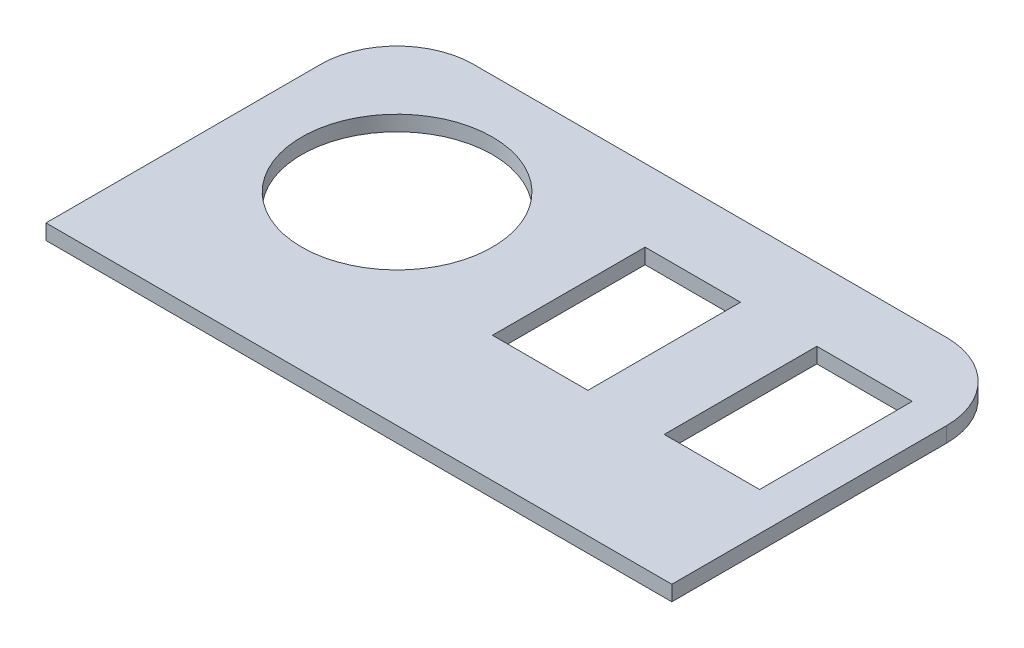
ISO-10303-21;
HEADER;
FILE_DESCRIPTION(('STEP AP214'),'2;1');
FILE_NAME('part.step','',(''),(''),'','','');
FILE_SCHEMA(('AUTOMOTIVE_DESIGN { 1 0 10303 214 1 1 1 1 }'));
ENDSEC;
DATA;
#1=APPLICATION_CONTEXT('core data for automotive mechanical design processes');
#2=APPLICATION_PROTOCOL_DEFINITION('international standard','automotive_design',2000,#1);
#3=PRODUCT_CONTEXT('',#1,'mechanical');
#4=PRODUCT('Part','Part','',(#3));
#5=PRODUCT_RELATED_PRODUCT_CATEGORY('part','',(#4));
#6=PRODUCT_DEFINITION_FORMATION('','',#4);
#7=PRODUCT_DEFINITION_CONTEXT('part definition',#1,'design');
#8=PRODUCT_DEFINITION('design','',#6,#7);
#9=PRODUCT_DEFINITION_SHAPE('','',#8);
#10=(LENGTH_UNIT() NAMED_UNIT(*) SI_UNIT(.MILLI.,.METRE.));
#11=(NAMED_UNIT(*) PLANE_ANGLE_UNIT() SI_UNIT($,.RADIAN.));
#12=(NAMED_UNIT(*) SI_UNIT($,.STERADIAN.) SOLID_ANGLE_UNIT());
#13=UNCERTAINTY_MEASURE_WITH_UNIT(LENGTH_MEASURE(1.E-05),#10,'distance_accuracy_value','');
#14=(GEOMETRIC_REPRESENTATION_CONTEXT(3) GLOBAL_UNCERTAINTY_ASSIGNED_CONTEXT((#13)) GLOBAL_UNIT_ASSIGNED_CONTEXT((#10,
#11,#12)) REPRESENTATION_CONTEXT('',''));
#15=CARTESIAN_POINT('',(0.,0.,0.));
#16=DIRECTION('',(0.,0.,1.));
#17=DIRECTION('',(1.,0.,0.));
#18=AXIS2_PLACEMENT_3D('',#15,#16,#17);
#19=CARTESIAN_POINT('',(0.,2.,0.));
#20=DIRECTION('',(0.,1.,0.));
#21=DIRECTION('',(0.,0.,1.));
#22=AXIS2_PLACEMENT_3D('',#19,#20,#21);
#23=PLANE('',#22);
#24=DIRECTION('',(-1.,0.,0.));
#25=VECTOR('',#24,1.);
#26=CARTESIAN_POINT('',(1.,2.,-13.5));
#27=LINE('',#26,#25);
#28=CARTESIAN_POINT('',(13.5,2.,-13.5));
#29=VERTEX_POINT('',#28);
#30=CARTESIAN_POINT('',(1.,2.,-13.5));
#31=VERTEX_POINT('',#30);
#32=EDGE_CURVE('E183',#29,#31,#27,.T.);
#33=ORIENTED_EDGE('',*,*,#32,.F.);
#34=DIRECTION('',(0.,0.,-1.));
#35=VECTOR('',#34,1.);
#36=CARTESIAN_POINT('',(13.5,2.,6.5));
#37=LINE('',#36,#35);
#38=CARTESIAN_POINT('',(13.5,2.,6.5));
#39=VERTEX_POINT('',#38);
#40=EDGE_CURVE('E181',#39,#29,#37,.T.);
#41=ORIENTED_EDGE('',*,*,#40,.F.);
#42=DIRECTION('',(1.,0.,0.));
#43=VECTOR('',#42,1.);
#44=CARTESIAN_POINT('',(1.,2.,6.5));
#45=LINE('',#44,#43);
#46=CARTESIAN_POINT('',(1.,2.,6.5));
#47=VERTEX_POINT('',#46);
#48=EDGE_CURVE('E189',#47,#39,#45,.T.);
#49=ORIENTED_EDGE('',*,*,#48,.F.);
#50=DIRECTION('',(0.,0.,1.));
#51=VECTOR('',#50,1.);
#52=CARTESIAN_POINT('',(1.,2.,6.5));
#53=LINE('',#52,#51);
#54=EDGE_CURVE('E186',#31,#47,#53,.T.);
#55=ORIENTED_EDGE('',*,*,#54,.F.);
#56=EDGE_LOOP('',(#33,#41,#49,#55));
#57=FACE_BOUND('',#56,.T.);
#58=DIRECTION('',(0.,0.,-1.));
#59=VECTOR('',#58,1.);
#60=CARTESIAN_POINT('',(41.,2.,-23.));
#61=LINE('',#60,#59);
#62=CARTESIAN_POINT('',(41.,2.,23.));
#63=VERTEX_POINT('',#62);
#64=CARTESIAN_POINT('',(41.,2.,-13.));
#65=VERTEX_POINT('',#64);
#66=EDGE_CURVE('E218',#63,#65,#61,.T.);
#67=ORIENTED_EDGE('',*,*,#66,.T.);
#68=CARTESIAN_POINT('',(31.,2.,-13.));
#69=DIRECTION('',(0.,1.,0.));
#70=DIRECTION('',(0.,0.,1.));
#71=AXIS2_PLACEMENT_3D('',#68,#69,#70);
#72=CIRCLE('',#71,10.);
#73=CARTESIAN_POINT('',(31.,2.,-23.));
#74=VERTEX_POINT('',#73);
#75=EDGE_CURVE('E43',#65,#74,#72,.T.);
#76=ORIENTED_EDGE('',*,*,#75,.T.);
#77=DIRECTION('',(-1.,0.,0.));
#78=VECTOR('',#77,1.);
#79=CARTESIAN_POINT('',(-41.,2.,-23.));
#80=LINE('',#79,#78);
#81=CARTESIAN_POINT('',(-31.,2.,-23.));
#82=VERTEX_POINT('',#81);
#83=EDGE_CURVE('E220',#74,#82,#80,.T.);
#84=ORIENTED_EDGE('',*,*,#83,.T.);
#85=CARTESIAN_POINT('',(-31.,2.,-13.));
#86=DIRECTION('',(0.,1.,0.));
#87=DIRECTION('',(0.,0.,1.));
#88=AXIS2_PLACEMENT_3D('',#85,#86,#87);
#89=CIRCLE('',#88,10.);
#90=CARTESIAN_POINT('',(-41.,2.,-13.));
#91=VERTEX_POINT('',#90);
#92=EDGE_CURVE('E50',#82,#91,#89,.T.);
#93=ORIENTED_EDGE('',*,*,#92,.T.);
#94=DIRECTION('',(0.,0.,1.));
#95=VECTOR('',#94,1.);
#96=CARTESIAN_POINT('',(-41.,2.,-23.));
#97=LINE('',#96,#95);
#98=CARTESIAN_POINT('',(-41.,2.,23.));
#99=VERTEX_POINT('',#98);
#100=EDGE_CURVE('E223',#91,#99,#97,.T.);
#101=ORIENTED_EDGE('',*,*,#100,.T.);
#102=DIRECTION('',(1.,0.,0.));
#103=VECTOR('',#102,1.);
#104=CARTESIAN_POINT('',(-41.,2.,23.));
#105=LINE('',#104,#103);
#106=EDGE_CURVE('E225',#99,#63,#105,.T.);
#107=ORIENTED_EDGE('',*,*,#106,.T.);
#108=EDGE_LOOP('',(#67,#76,#84,#93,#101,#107));
#109=FACE_BOUND('',#108,.T.);
#110=CARTESIAN_POINT('',(-21.5,2.,-3.5));
#111=DIRECTION('',(0.,1.,0.));
#112=DIRECTION('',(0.,0.,1.));
#113=AXIS2_PLACEMENT_3D('',#110,#111,#112);
#114=CIRCLE('',#113,12.5);
#115=CARTESIAN_POINT('',(-21.5,2.,9.));
#116=VERTEX_POINT('',#115);
#117=EDGE_CURVE('E212',#116,#116,#114,.T.);
#118=ORIENTED_EDGE('',*,*,#117,.F.);
#119=EDGE_LOOP('',(#118));
#120=FACE_BOUND('',#119,.T.);
#121=DIRECTION('',(-1.,0.,0.));
#122=VECTOR('',#121,1.);
#123=CARTESIAN_POINT('',(23.5,2.,-13.5));
#124=LINE('',#123,#122);
#125=CARTESIAN_POINT('',(36.,2.,-13.5));
#126=VERTEX_POINT('',#125);
#127=CARTESIAN_POINT('',(23.5,2.,-13.5));
#128=VERTEX_POINT('',#127);
#129=EDGE_CURVE('E150',#126,#128,#124,.T.);
#130=ORIENTED_EDGE('',*,*,#129,.F.);
#131=DIRECTION('',(0.,0.,-1.));
#132=VECTOR('',#131,1.);
#133=CARTESIAN_POINT('',(36.,2.,6.5));
#134=LINE('',#133,#132);
#135=CARTESIAN_POINT('',(36.,2.,6.5));
#136=VERTEX_POINT('',#135);
#137=EDGE_CURVE('E140',#136,#126,#134,.T.);
#138=ORIENTED_EDGE('',*,*,#137,.F.);
#139=DIRECTION('',(1.,0.,0.));
#140=VECTOR('',#139,1.);
#141=CARTESIAN_POINT('',(23.5,2.,6.5));
#142=LINE('',#141,#140);
#143=CARTESIAN_POINT('',(23.5,2.,6.5));
#144=VERTEX_POINT('',#143);
#145=EDGE_CURVE('E165',#144,#136,#142,.T.);
#146=ORIENTED_EDGE('',*,*,#145,.F.);
#147=DIRECTION('',(0.,0.,1.));
#148=VECTOR('',#147,1.);
#149=CARTESIAN_POINT('',(23.5,2.,6.5));
#150=LINE('',#149,#148);
#151=EDGE_CURVE('E163',#128,#144,#150,.T.);
#152=ORIENTED_EDGE('',*,*,#151,.F.);
#153=EDGE_LOOP('',(#130,#138,#146,#152));
#154=FACE_BOUND('',#153,.T.);
#155=ADVANCED_FACE('F35',(#57,#109,#120,#154),#23,.T.);
#156=CARTESIAN_POINT('',(0.,0.,0.));
#157=DIRECTION('',(0.,1.,0.));
#158=DIRECTION('',(0.,0.,1.));
#159=AXIS2_PLACEMENT_3D('',#156,#157,#158);
#160=PLANE('',#159);
#161=DIRECTION('',(0.,0.,-1.));
#162=VECTOR('',#161,1.);
#163=CARTESIAN_POINT('',(13.5,0.,6.5));
#164=LINE('',#163,#162);
#165=CARTESIAN_POINT('',(13.5,0.,6.5));
#166=VERTEX_POINT('',#165);
#167=CARTESIAN_POINT('',(13.5,0.,-13.5));
#168=VERTEX_POINT('',#167);
#169=EDGE_CURVE('E158',#166,#168,#164,.T.);
#170=ORIENTED_EDGE('',*,*,#169,.T.);
#171=DIRECTION('',(-1.,0.,0.));
#172=VECTOR('',#171,1.);
#173=CARTESIAN_POINT('',(1.,0.,-13.5));
#174=LINE('',#173,#172);
#175=CARTESIAN_POINT('',(1.,0.,-13.5));
#176=VERTEX_POINT('',#175);
#177=EDGE_CURVE('E194',#168,#176,#174,.T.);
#178=ORIENTED_EDGE('',*,*,#177,.T.);
#179=DIRECTION('',(0.,0.,1.));
#180=VECTOR('',#179,1.);
#181=CARTESIAN_POINT('',(1.,0.,6.5));
#182=LINE('',#181,#180);
#183=CARTESIAN_POINT('',(1.,0.,6.5));
#184=VERTEX_POINT('',#183);
#185=EDGE_CURVE('E197',#176,#184,#182,.T.);
#186=ORIENTED_EDGE('',*,*,#185,.T.);
#187=DIRECTION('',(1.,0.,0.));
#188=VECTOR('',#187,1.);
#189=CARTESIAN_POINT('',(1.,0.,6.5));
#190=LINE('',#189,#188);
#191=EDGE_CURVE('E184',#184,#166,#190,.T.);
#192=ORIENTED_EDGE('',*,*,#191,.T.);
#193=EDGE_LOOP('',(#170,#178,#186,#192));
#194=FACE_BOUND('',#193,.T.);
#195=DIRECTION('',(-1.,0.,0.));
#196=VECTOR('',#195,1.);
#197=CARTESIAN_POINT('',(-41.,0.,-23.));
#198=LINE('',#197,#196);
#199=CARTESIAN_POINT('',(31.,0.,-23.));
#200=VERTEX_POINT('',#199);
#201=CARTESIAN_POINT('',(-31.,0.,-23.));
#202=VERTEX_POINT('',#201);
#203=EDGE_CURVE('E229',#200,#202,#198,.T.);
#204=ORIENTED_EDGE('',*,*,#203,.F.);
#205=CARTESIAN_POINT('',(31.,0.,-13.));
#206=DIRECTION('',(0.,1.,0.));
#207=DIRECTION('',(0.,0.,1.));
#208=AXIS2_PLACEMENT_3D('',#205,#206,#207);
#209=CIRCLE('',#208,10.);
#210=CARTESIAN_POINT('',(41.,0.,-13.));
#211=VERTEX_POINT('',#210);
#212=EDGE_CURVE('E247',#200,#211,#209,.F.);
#213=ORIENTED_EDGE('',*,*,#212,.T.);
#214=DIRECTION('',(0.,0.,-1.));
#215=VECTOR('',#214,1.);
#216=CARTESIAN_POINT('',(41.,0.,-23.));
#217=LINE('',#216,#215);
#218=CARTESIAN_POINT('',(41.,0.,23.));
#219=VERTEX_POINT('',#218);
#220=EDGE_CURVE('E215',#219,#211,#217,.T.);
#221=ORIENTED_EDGE('',*,*,#220,.F.);
#222=DIRECTION('',(1.,0.,0.));
#223=VECTOR('',#222,1.);
#224=CARTESIAN_POINT('',(-41.,0.,23.));
#225=LINE('',#224,#223);
#226=CARTESIAN_POINT('',(-41.,0.,23.));
#227=VERTEX_POINT('',#226);
#228=EDGE_CURVE('E221',#227,#219,#225,.T.);
#229=ORIENTED_EDGE('',*,*,#228,.F.);
#230=DIRECTION('',(0.,0.,1.));
#231=VECTOR('',#230,1.);
#232=CARTESIAN_POINT('',(-41.,0.,-23.));
#233=LINE('',#232,#231);
#234=CARTESIAN_POINT('',(-41.,0.,-13.));
#235=VERTEX_POINT('',#234);
#236=EDGE_CURVE('E232',#235,#227,#233,.T.);
#237=ORIENTED_EDGE('',*,*,#236,.F.);
#238=CARTESIAN_POINT('',(-31.,0.,-13.));
#239=DIRECTION('',(0.,1.,0.));
#240=DIRECTION('',(0.,0.,1.));
#241=AXIS2_PLACEMENT_3D('',#238,#239,#240);
#242=CIRCLE('',#241,10.);
#243=EDGE_CURVE('E245',#235,#202,#242,.F.);
#244=ORIENTED_EDGE('',*,*,#243,.T.);
#245=EDGE_LOOP('',(#204,#213,#221,#229,#237,#244));
#246=FACE_BOUND('',#245,.T.);
#247=CARTESIAN_POINT('',(-21.5,0.,-3.5));
#248=DIRECTION('',(0.,1.,0.));
#249=DIRECTION('',(0.,0.,1.));
#250=AXIS2_PLACEMENT_3D('',#247,#248,#249);
#251=CIRCLE('',#250,12.5);
#252=CARTESIAN_POINT('',(-21.5,0.,9.));
#253=VERTEX_POINT('',#252);
#254=EDGE_CURVE('E211',#253,#253,#251,.T.);
#255=ORIENTED_EDGE('',*,*,#254,.T.);
#256=EDGE_LOOP('',(#255));
#257=FACE_BOUND('',#256,.T.);
#258=DIRECTION('',(0.,0.,-1.));
#259=VECTOR('',#258,1.);
#260=CARTESIAN_POINT('',(36.,0.,6.5));
#261=LINE('',#260,#259);
#262=CARTESIAN_POINT('',(36.,0.,6.5));
#263=VERTEX_POINT('',#262);
#264=CARTESIAN_POINT('',(36.,0.,-13.5));
#265=VERTEX_POINT('',#264);
#266=EDGE_CURVE('E169',#263,#265,#261,.T.);
#267=ORIENTED_EDGE('',*,*,#266,.T.);
#268=DIRECTION('',(-1.,0.,0.));
#269=VECTOR('',#268,1.);
#270=CARTESIAN_POINT('',(23.5,0.,-13.5));
#271=LINE('',#270,#269);
#272=CARTESIAN_POINT('',(23.5,0.,-13.5));
#273=VERTEX_POINT('',#272);
#274=EDGE_CURVE('E157',#265,#273,#271,.T.);
#275=ORIENTED_EDGE('',*,*,#274,.T.);
#276=DIRECTION('',(0.,0.,1.));
#277=VECTOR('',#276,1.);
#278=CARTESIAN_POINT('',(23.5,0.,6.5));
#279=LINE('',#278,#277);
#280=CARTESIAN_POINT('',(23.5,0.,6.5));
#281=VERTEX_POINT('',#280);
#282=EDGE_CURVE('E172',#273,#281,#279,.T.);
#283=ORIENTED_EDGE('',*,*,#282,.T.);
#284=DIRECTION('',(1.,0.,0.));
#285=VECTOR('',#284,1.);
#286=CARTESIAN_POINT('',(23.5,0.,6.5));
#287=LINE('',#286,#285);
#288=EDGE_CURVE('E151',#281,#263,#287,.T.);
#289=ORIENTED_EDGE('',*,*,#288,.T.);
#290=EDGE_LOOP('',(#267,#275,#283,#289));
#291=FACE_BOUND('',#290,.T.);
#292=ADVANCED_FACE('F262',(#194,#246,#257,#291),#160,.F.);
#293=CARTESIAN_POINT('',(41.,2.,-23.));
#294=DIRECTION('',(-1.,0.,0.));
#295=DIRECTION('',(0.,0.,1.));
#296=AXIS2_PLACEMENT_3D('',#293,#294,#295);
#297=PLANE('',#296);
#298=ORIENTED_EDGE('',*,*,#220,.T.);
#299=DIRECTION('',(0.,-1.,0.));
#300=VECTOR('',#299,1.);
#301=CARTESIAN_POINT('',(41.,2.,-13.));
#302=LINE('',#301,#300);
#303=EDGE_CURVE('E58',#211,#65,#302,.F.);
#304=ORIENTED_EDGE('',*,*,#303,.T.);
#305=ORIENTED_EDGE('',*,*,#66,.F.);
#306=DIRECTION('',(0.,-1.,0.));
#307=VECTOR('',#306,1.);
#308=CARTESIAN_POINT('',(41.,2.,23.));
#309=LINE('',#308,#307);
#310=EDGE_CURVE('E227',#63,#219,#309,.T.);
#311=ORIENTED_EDGE('',*,*,#310,.T.);
#312=EDGE_LOOP('',(#298,#304,#305,#311));
#313=FACE_BOUND('',#312,.T.);
#314=ADVANCED_FACE('F265',(#313),#297,.F.);
#315=CARTESIAN_POINT('',(-41.,2.,-23.));
#316=DIRECTION('',(0.,0.,1.));
#317=DIRECTION('',(1.,0.,0.));
#318=AXIS2_PLACEMENT_3D('',#315,#316,#317);
#319=PLANE('',#318);
#320=ORIENTED_EDGE('',*,*,#83,.F.);
#321=DIRECTION('',(0.,-1.,0.));
#322=VECTOR('',#321,1.);
#323=CARTESIAN_POINT('',(31.,2.,-23.));
#324=LINE('',#323,#322);
#325=EDGE_CURVE('E242',#74,#200,#324,.T.);
#326=ORIENTED_EDGE('',*,*,#325,.T.);
#327=ORIENTED_EDGE('',*,*,#203,.T.);
#328=DIRECTION('',(0.,-1.,0.));
#329=VECTOR('',#328,1.);
#330=CARTESIAN_POINT('',(-31.,2.,-23.));
#331=LINE('',#330,#329);
#332=EDGE_CURVE('E240',#202,#82,#331,.F.);
#333=ORIENTED_EDGE('',*,*,#332,.T.);
#334=EDGE_LOOP('',(#320,#326,#327,#333));
#335=FACE_BOUND('',#334,.T.);
#336=ADVANCED_FACE('F256',(#335),#319,.F.);
#337=CARTESIAN_POINT('',(-41.,2.,-23.));
#338=DIRECTION('',(1.,0.,0.));
#339=DIRECTION('',(0.,0.,-1.));
#340=AXIS2_PLACEMENT_3D('',#337,#338,#339);
#341=PLANE('',#340);
#342=ORIENTED_EDGE('',*,*,#100,.F.);
#343=DIRECTION('',(0.,-1.,0.));
#344=VECTOR('',#343,1.);
#345=CARTESIAN_POINT('',(-41.,2.,-13.));
#346=LINE('',#345,#344);
#347=EDGE_CURVE('E11',#91,#235,#346,.T.);
#348=ORIENTED_EDGE('',*,*,#347,.T.);
#349=ORIENTED_EDGE('',*,*,#236,.T.);
#350=DIRECTION('',(0.,-1.,0.));
#351=VECTOR('',#350,1.);
#352=CARTESIAN_POINT('',(-41.,2.,23.));
#353=LINE('',#352,#351);
#354=EDGE_CURVE('E237',#99,#227,#353,.T.);
#355=ORIENTED_EDGE('',*,*,#354,.F.);
#356=EDGE_LOOP('',(#342,#348,#349,#355));
#357=FACE_BOUND('',#356,.T.);
#358=ADVANCED_FACE('F273',(#357),#341,.F.);
#359=CARTESIAN_POINT('',(-41.,2.,23.));
#360=DIRECTION('',(0.,0.,-1.));
#361=DIRECTION('',(-1.,0.,0.));
#362=AXIS2_PLACEMENT_3D('',#359,#360,#361);
#363=PLANE('',#362);
#364=ORIENTED_EDGE('',*,*,#228,.T.);
#365=ORIENTED_EDGE('',*,*,#310,.F.);
#366=ORIENTED_EDGE('',*,*,#106,.F.);
#367=ORIENTED_EDGE('',*,*,#354,.T.);
#368=EDGE_LOOP('',(#364,#365,#366,#367));
#369=FACE_BOUND('',#368,.T.);
#370=ADVANCED_FACE('F269',(#369),#363,.F.);
#371=CARTESIAN_POINT('',(-21.5,2.,-3.5));
#372=DIRECTION('',(0.,-1.,0.));
#373=DIRECTION('',(0.,0.,-1.));
#374=AXIS2_PLACEMENT_3D('',#371,#372,#373);
#375=CYLINDRICAL_SURFACE('',#374,12.5);
#376=ORIENTED_EDGE('',*,*,#117,.T.);
#377=EDGE_LOOP('',(#376));
#378=FACE_BOUND('',#377,.T.);
#379=ORIENTED_EDGE('',*,*,#254,.F.);
#380=EDGE_LOOP('',(#379));
#381=FACE_BOUND('',#380,.T.);
#382=ADVANCED_FACE('F291',(#378,#381),#375,.F.);
#383=CARTESIAN_POINT('',(13.5,2.,6.5));
#384=DIRECTION('',(-1.,0.,0.));
#385=DIRECTION('',(0.,0.,1.));
#386=AXIS2_PLACEMENT_3D('',#383,#384,#385);
#387=PLANE('',#386);
#388=ORIENTED_EDGE('',*,*,#169,.F.);
#389=DIRECTION('',(0.,-1.,0.));
#390=VECTOR('',#389,1.);
#391=CARTESIAN_POINT('',(13.5,2.,6.5));
#392=LINE('',#391,#390);
#393=EDGE_CURVE('E191',#39,#166,#392,.T.);
#394=ORIENTED_EDGE('',*,*,#393,.F.);
#395=ORIENTED_EDGE('',*,*,#40,.T.);
#396=DIRECTION('',(0.,-1.,0.));
#397=VECTOR('',#396,1.);
#398=CARTESIAN_POINT('',(13.5,2.,-13.5));
#399=LINE('',#398,#397);
#400=EDGE_CURVE('E208',#29,#168,#399,.T.);
#401=ORIENTED_EDGE('',*,*,#400,.T.);
#402=EDGE_LOOP('',(#388,#394,#395,#401));
#403=FACE_BOUND('',#402,.T.);
#404=ADVANCED_FACE('F324',(#403),#387,.T.);
#405=CARTESIAN_POINT('',(1.,2.,-13.5));
#406=DIRECTION('',(0.,0.,1.));
#407=DIRECTION('',(1.,0.,0.));
#408=AXIS2_PLACEMENT_3D('',#405,#406,#407);
#409=PLANE('',#408);
#410=ORIENTED_EDGE('',*,*,#177,.F.);
#411=ORIENTED_EDGE('',*,*,#400,.F.);
#412=ORIENTED_EDGE('',*,*,#32,.T.);
#413=DIRECTION('',(0.,-1.,0.));
#414=VECTOR('',#413,1.);
#415=CARTESIAN_POINT('',(1.,2.,-13.5));
#416=LINE('',#415,#414);
#417=EDGE_CURVE('E206',#31,#176,#416,.T.);
#418=ORIENTED_EDGE('',*,*,#417,.T.);
#419=EDGE_LOOP('',(#410,#411,#412,#418));
#420=FACE_BOUND('',#419,.T.);
#421=ADVANCED_FACE('F331',(#420),#409,.T.);
#422=CARTESIAN_POINT('',(1.,2.,6.5));
#423=DIRECTION('',(1.,0.,0.));
#424=DIRECTION('',(0.,0.,-1.));
#425=AXIS2_PLACEMENT_3D('',#422,#423,#424);
#426=PLANE('',#425);
#427=ORIENTED_EDGE('',*,*,#185,.F.);
#428=ORIENTED_EDGE('',*,*,#417,.F.);
#429=ORIENTED_EDGE('',*,*,#54,.T.);
#430=DIRECTION('',(0.,-1.,0.));
#431=VECTOR('',#430,1.);
#432=CARTESIAN_POINT('',(1.,2.,6.5));
#433=LINE('',#432,#431);
#434=EDGE_CURVE('E204',#47,#184,#433,.T.);
#435=ORIENTED_EDGE('',*,*,#434,.T.);
#436=EDGE_LOOP('',(#427,#428,#429,#435));
#437=FACE_BOUND('',#436,.T.);
#438=ADVANCED_FACE('F338',(#437),#426,.T.);
#439=CARTESIAN_POINT('',(1.,2.,6.5));
#440=DIRECTION('',(0.,0.,-1.));
#441=DIRECTION('',(-1.,0.,0.));
#442=AXIS2_PLACEMENT_3D('',#439,#440,#441);
#443=PLANE('',#442);
#444=ORIENTED_EDGE('',*,*,#191,.F.);
#445=ORIENTED_EDGE('',*,*,#434,.F.);
#446=ORIENTED_EDGE('',*,*,#48,.T.);
#447=ORIENTED_EDGE('',*,*,#393,.T.);
#448=EDGE_LOOP('',(#444,#445,#446,#447));
#449=FACE_BOUND('',#448,.T.);
#450=ADVANCED_FACE('F346',(#449),#443,.T.);
#451=CARTESIAN_POINT('',(36.,2.,6.5));
#452=DIRECTION('',(-1.,0.,0.));
#453=DIRECTION('',(0.,0.,1.));
#454=AXIS2_PLACEMENT_3D('',#451,#452,#453);
#455=PLANE('',#454);
#456=ORIENTED_EDGE('',*,*,#266,.F.);
#457=DIRECTION('',(0.,-1.,0.));
#458=VECTOR('',#457,1.);
#459=CARTESIAN_POINT('',(36.,2.,6.5));
#460=LINE('',#459,#458);
#461=EDGE_CURVE('E146',#136,#263,#460,.T.);
#462=ORIENTED_EDGE('',*,*,#461,.F.);
#463=ORIENTED_EDGE('',*,*,#137,.T.);
#464=DIRECTION('',(0.,-1.,0.));
#465=VECTOR('',#464,1.);
#466=CARTESIAN_POINT('',(36.,2.,-13.5));
#467=LINE('',#466,#465);
#468=EDGE_CURVE('E143',#126,#265,#467,.T.);
#469=ORIENTED_EDGE('',*,*,#468,.T.);
#470=EDGE_LOOP('',(#456,#462,#463,#469));
#471=FACE_BOUND('',#470,.T.);
#472=ADVANCED_FACE('F142',(#471),#455,.T.);
#473=CARTESIAN_POINT('',(23.5,2.,-13.5));
#474=DIRECTION('',(0.,0.,1.));
#475=DIRECTION('',(1.,0.,0.));
#476=AXIS2_PLACEMENT_3D('',#473,#474,#475);
#477=PLANE('',#476);
#478=ORIENTED_EDGE('',*,*,#274,.F.);
#479=ORIENTED_EDGE('',*,*,#468,.F.);
#480=ORIENTED_EDGE('',*,*,#129,.T.);
#481=DIRECTION('',(0.,-1.,0.));
#482=VECTOR('',#481,1.);
#483=CARTESIAN_POINT('',(23.5,2.,-13.5));
#484=LINE('',#483,#482);
#485=EDGE_CURVE('E159',#128,#273,#484,.T.);
#486=ORIENTED_EDGE('',*,*,#485,.T.);
#487=EDGE_LOOP('',(#478,#479,#480,#486));
#488=FACE_BOUND('',#487,.T.);
#489=ADVANCED_FACE('F154',(#488),#477,.T.);
#490=CARTESIAN_POINT('',(23.5,2.,6.5));
#491=DIRECTION('',(1.,0.,0.));
#492=DIRECTION('',(0.,0.,-1.));
#493=AXIS2_PLACEMENT_3D('',#490,#491,#492);
#494=PLANE('',#493);
#495=ORIENTED_EDGE('',*,*,#282,.F.);
#496=ORIENTED_EDGE('',*,*,#485,.F.);
#497=ORIENTED_EDGE('',*,*,#151,.T.);
#498=DIRECTION('',(0.,-1.,0.));
#499=VECTOR('',#498,1.);
#500=CARTESIAN_POINT('',(23.5,2.,6.5));
#501=LINE('',#500,#499);
#502=EDGE_CURVE('E178',#144,#281,#501,.T.);
#503=ORIENTED_EDGE('',*,*,#502,.T.);
#504=EDGE_LOOP('',(#495,#496,#497,#503));
#505=FACE_BOUND('',#504,.T.);
#506=ADVANCED_FACE('F367',(#505),#494,.T.);
#507=CARTESIAN_POINT('',(23.5,2.,6.5));
#508=DIRECTION('',(0.,0.,-1.));
#509=DIRECTION('',(-1.,0.,0.));
#510=AXIS2_PLACEMENT_3D('',#507,#508,#509);
#511=PLANE('',#510);
#512=ORIENTED_EDGE('',*,*,#288,.F.);
#513=ORIENTED_EDGE('',*,*,#502,.F.);
#514=ORIENTED_EDGE('',*,*,#145,.T.);
#515=ORIENTED_EDGE('',*,*,#461,.T.);
#516=EDGE_LOOP('',(#512,#513,#514,#515));
#517=FACE_BOUND('',#516,.T.);
#518=ADVANCED_FACE('F280',(#517),#511,.T.);
#519=CARTESIAN_POINT('',(31.,2.,-13.));
#520=DIRECTION('',(0.,-1.,0.));
#521=DIRECTION('',(0.,0.,-1.));
#522=AXIS2_PLACEMENT_3D('',#519,#520,#521);
#523=CYLINDRICAL_SURFACE('',#522,10.);
#524=ORIENTED_EDGE('',*,*,#75,.F.);
#525=ORIENTED_EDGE('',*,*,#303,.F.);
#526=ORIENTED_EDGE('',*,*,#212,.F.);
#527=ORIENTED_EDGE('',*,*,#325,.F.);
#528=EDGE_LOOP('',(#524,#525,#526,#527));
#529=FACE_BOUND('',#528,.T.);
#530=ADVANCED_FACE('F259',(#529),#523,.T.);
#531=CARTESIAN_POINT('',(-31.,2.,-13.));
#532=DIRECTION('',(0.,-1.,0.));
#533=DIRECTION('',(0.,0.,-1.));
#534=AXIS2_PLACEMENT_3D('',#531,#532,#533);
#535=CYLINDRICAL_SURFACE('',#534,10.);
#536=ORIENTED_EDGE('',*,*,#92,.F.);
#537=ORIENTED_EDGE('',*,*,#332,.F.);
#538=ORIENTED_EDGE('',*,*,#243,.F.);
#539=ORIENTED_EDGE('',*,*,#347,.F.);
#540=EDGE_LOOP('',(#536,#537,#538,#539));
#541=FACE_BOUND('',#540,.T.);
#542=ADVANCED_FACE('F37',(#541),#535,.T.);
#543=CLOSED_SHELL('',(#155,#292,#314,#336,#358,#370,#382,#404,#421,#438,#450,#472,#489,#506,
#518,#530,#542));
#544=MANIFOLD_SOLID_BREP('B2',#543);
#545=ADVANCED_BREP_SHAPE_REPRESENTATION('',(#18,#544),#14);
#546=SHAPE_DEFINITION_REPRESENTATION(#9,#545);
ENDSEC;
END-ISO-10303-21;
